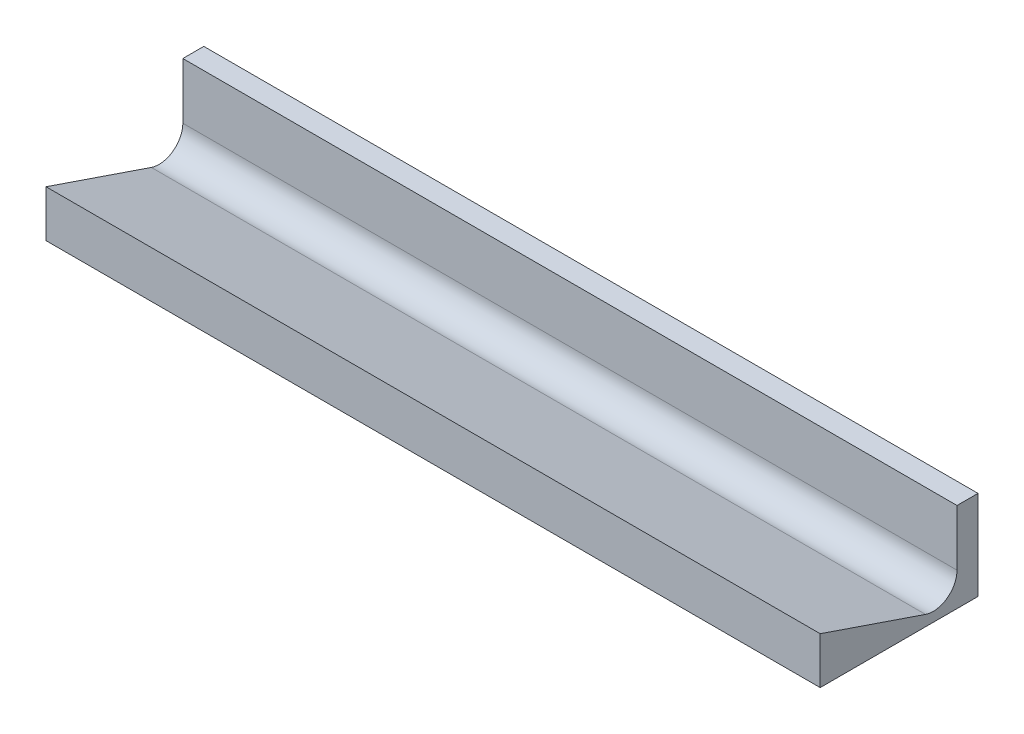
ISO-10303-21;
HEADER;
FILE_DESCRIPTION(('STEP AP214'),'2;1');
FILE_NAME('part.step','',(''),(''),'','','');
FILE_SCHEMA(('AUTOMOTIVE_DESIGN { 1 0 10303 214 1 1 1 1 }'));
ENDSEC;
DATA;
#1=APPLICATION_CONTEXT('core data for automotive mechanical design processes');
#2=APPLICATION_PROTOCOL_DEFINITION('international standard','automotive_design',2000,#1);
#3=PRODUCT_CONTEXT('',#1,'mechanical');
#4=PRODUCT('Part','Part','',(#3));
#5=PRODUCT_RELATED_PRODUCT_CATEGORY('part','',(#4));
#6=PRODUCT_DEFINITION_FORMATION('','',#4);
#7=PRODUCT_DEFINITION_CONTEXT('part definition',#1,'design');
#8=PRODUCT_DEFINITION('design','',#6,#7);
#9=PRODUCT_DEFINITION_SHAPE('','',#8);
#10=(LENGTH_UNIT() NAMED_UNIT(*) SI_UNIT(.MILLI.,.METRE.));
#11=(NAMED_UNIT(*) PLANE_ANGLE_UNIT() SI_UNIT($,.RADIAN.));
#12=(NAMED_UNIT(*) SI_UNIT($,.STERADIAN.) SOLID_ANGLE_UNIT());
#13=UNCERTAINTY_MEASURE_WITH_UNIT(LENGTH_MEASURE(1.E-05),#10,'distance_accuracy_value','');
#14=(GEOMETRIC_REPRESENTATION_CONTEXT(3) GLOBAL_UNCERTAINTY_ASSIGNED_CONTEXT((#13)) GLOBAL_UNIT_ASSIGNED_CONTEXT((#10,
#11,#12)) REPRESENTATION_CONTEXT('',''));
#15=CARTESIAN_POINT('',(0.,0.,0.));
#16=DIRECTION('',(0.,0.,1.));
#17=DIRECTION('',(1.,0.,0.));
#18=AXIS2_PLACEMENT_3D('',#15,#16,#17);
#19=CARTESIAN_POINT('',(-45.,-8.,-8.25));
#20=DIRECTION('',(0.,0.,1.));
#21=DIRECTION('',(1.,0.,0.));
#22=AXIS2_PLACEMENT_3D('',#19,#20,#21);
#23=PLANE('',#22);
#24=DIRECTION('',(1.,0.,0.));
#25=VECTOR('',#24,1.);
#26=CARTESIAN_POINT('',(-45.,-8.,-8.25));
#27=LINE('',#26,#25);
#28=CARTESIAN_POINT('',(-42.,-8.,-8.25));
#29=VERTEX_POINT('',#28);
#30=CARTESIAN_POINT('',(-40.,-8.,-8.25));
#31=VERTEX_POINT('',#30);
#32=EDGE_CURVE('E260',#29,#31,#27,.T.);
#33=ORIENTED_EDGE('',*,*,#32,.F.);
#34=DIRECTION('',(0.,1.,0.));
#35=VECTOR('',#34,1.);
#36=CARTESIAN_POINT('',(-42.,0.,-8.25));
#37=LINE('',#36,#35);
#38=CARTESIAN_POINT('',(-42.,0.,-8.25));
#39=VERTEX_POINT('',#38);
#40=EDGE_CURVE('E243',#29,#39,#37,.T.);
#41=ORIENTED_EDGE('',*,*,#40,.T.);
#42=DIRECTION('',(1.,0.,0.));
#43=VECTOR('',#42,1.);
#44=CARTESIAN_POINT('',(-45.,0.,-8.25));
#45=LINE('',#44,#43);
#46=CARTESIAN_POINT('',(-40.,0.,-8.25));
#47=VERTEX_POINT('',#46);
#48=EDGE_CURVE('E257',#39,#47,#45,.T.);
#49=ORIENTED_EDGE('',*,*,#48,.T.);
#50=DIRECTION('',(0.,1.,0.));
#51=VECTOR('',#50,1.);
#52=CARTESIAN_POINT('',(-40.,-8.,-8.25));
#53=LINE('',#52,#51);
#54=CARTESIAN_POINT('',(-40.,-5.,-8.25));
#55=VERTEX_POINT('',#54);
#56=EDGE_CURVE('E287',#55,#47,#53,.T.);
#57=ORIENTED_EDGE('',*,*,#56,.F.);
#58=DIRECTION('',(-1.,0.,0.));
#59=VECTOR('',#58,1.);
#60=CARTESIAN_POINT('',(0.,-4.99999999999996,-8.25));
#61=LINE('',#60,#59);
#62=CARTESIAN_POINT('',(-39.,-5.,-8.25));
#63=VERTEX_POINT('',#62);
#64=EDGE_CURVE('E477',#63,#55,#61,.T.);
#65=ORIENTED_EDGE('',*,*,#64,.F.);
#66=DIRECTION('',(0.316227766016838,0.948683298050514,0.));
#67=VECTOR('',#66,1.);
#68=CARTESIAN_POINT('',(-33.6,11.2,-8.25));
#69=LINE('',#68,#67);
#70=EDGE_CURVE('E472',#31,#63,#69,.T.);
#71=ORIENTED_EDGE('',*,*,#70,.F.);
#72=EDGE_LOOP('',(#33,#41,#49,#57,#65,#71));
#73=FACE_BOUND('',#72,.T.);
#74=ADVANCED_FACE('F39',(#73),#23,.F.);
#75=CARTESIAN_POINT('',(-45.,-8.,-1.25));
#76=DIRECTION('',(0.,0.,-1.));
#77=DIRECTION('',(-1.,0.,0.));
#78=AXIS2_PLACEMENT_3D('',#75,#76,#77);
#79=PLANE('',#78);
#80=DIRECTION('',(-1.,0.,0.));
#81=VECTOR('',#80,1.);
#82=CARTESIAN_POINT('',(-45.,0.,-1.25));
#83=LINE('',#82,#81);
#84=CARTESIAN_POINT('',(-40.,0.,-1.25));
#85=VERTEX_POINT('',#84);
#86=CARTESIAN_POINT('',(-42.,0.,-1.25));
#87=VERTEX_POINT('',#86);
#88=EDGE_CURVE('E278',#85,#87,#83,.T.);
#89=ORIENTED_EDGE('',*,*,#88,.T.);
#90=DIRECTION('',(0.,1.,0.));
#91=VECTOR('',#90,1.);
#92=CARTESIAN_POINT('',(-42.,0.,-1.25));
#93=LINE('',#92,#91);
#94=CARTESIAN_POINT('',(-42.,-8.,-1.25));
#95=VERTEX_POINT('',#94);
#96=EDGE_CURVE('E246',#95,#87,#93,.T.);
#97=ORIENTED_EDGE('',*,*,#96,.F.);
#98=DIRECTION('',(-1.,0.,0.));
#99=VECTOR('',#98,1.);
#100=CARTESIAN_POINT('',(-45.,-8.,-1.25));
#101=LINE('',#100,#99);
#102=CARTESIAN_POINT('',(-40.,-8.,-1.25));
#103=VERTEX_POINT('',#102);
#104=EDGE_CURVE('E285',#103,#95,#101,.T.);
#105=ORIENTED_EDGE('',*,*,#104,.F.);
#106=DIRECTION('',(0.316227766016838,0.948683298050514,0.));
#107=VECTOR('',#106,1.);
#108=CARTESIAN_POINT('',(-33.6,11.2,-1.25));
#109=LINE('',#108,#107);
#110=CARTESIAN_POINT('',(-39.,-5.,-1.25));
#111=VERTEX_POINT('',#110);
#112=EDGE_CURVE('E473',#103,#111,#109,.T.);
#113=ORIENTED_EDGE('',*,*,#112,.T.);
#114=DIRECTION('',(-1.,0.,0.));
#115=VECTOR('',#114,1.);
#116=CARTESIAN_POINT('',(0.,-4.99999999999996,-1.25));
#117=LINE('',#116,#115);
#118=CARTESIAN_POINT('',(-40.,-5.,-1.25));
#119=VERTEX_POINT('',#118);
#120=EDGE_CURVE('E476',#111,#119,#117,.T.);
#121=ORIENTED_EDGE('',*,*,#120,.T.);
#122=DIRECTION('',(0.,1.,0.));
#123=VECTOR('',#122,1.);
#124=CARTESIAN_POINT('',(-40.,-8.,-1.25));
#125=LINE('',#124,#123);
#126=EDGE_CURVE('E284',#119,#85,#125,.T.);
#127=ORIENTED_EDGE('',*,*,#126,.T.);
#128=EDGE_LOOP('',(#89,#97,#105,#113,#121,#127));
#129=FACE_BOUND('',#128,.T.);
#130=ADVANCED_FACE('F382',(#129),#79,.F.);
#131=CARTESIAN_POINT('',(0.,-8.,0.));
#132=DIRECTION('',(0.,-1.,0.));
#133=DIRECTION('',(0.,0.,-1.));
#134=AXIS2_PLACEMENT_3D('',#131,#132,#133);
#135=PLANE('',#134);
#136=DIRECTION('',(0.,0.,1.));
#137=VECTOR('',#136,1.);
#138=CARTESIAN_POINT('',(-42.,-8.,-8.25));
#139=LINE('',#138,#137);
#140=EDGE_CURVE('E422',#29,#95,#139,.T.);
#141=ORIENTED_EDGE('',*,*,#140,.F.);
#142=ORIENTED_EDGE('',*,*,#32,.T.);
#143=DIRECTION('',(0.,0.,1.));
#144=VECTOR('',#143,1.);
#145=CARTESIAN_POINT('',(-40.,-8.,-1.25));
#146=LINE('',#145,#144);
#147=EDGE_CURVE('E543',#31,#103,#146,.T.);
#148=ORIENTED_EDGE('',*,*,#147,.T.);
#149=ORIENTED_EDGE('',*,*,#104,.T.);
#150=EDGE_LOOP('',(#141,#142,#148,#149));
#151=FACE_BOUND('',#150,.T.);
#152=ADVANCED_FACE('F388',(#151),#135,.T.);
#153=CARTESIAN_POINT('',(45.,-8.,-1.25));
#154=DIRECTION('',(0.,0.,-1.));
#155=DIRECTION('',(-1.,0.,0.));
#156=AXIS2_PLACEMENT_3D('',#153,#154,#155);
#157=PLANE('',#156);
#158=DIRECTION('',(0.,-1.,0.));
#159=VECTOR('',#158,1.);
#160=CARTESIAN_POINT('',(43.,0.,-1.25));
#161=LINE('',#160,#159);
#162=CARTESIAN_POINT('',(43.,0.,-1.25));
#163=VERTEX_POINT('',#162);
#164=CARTESIAN_POINT('',(43.,-8.,-1.25));
#165=VERTEX_POINT('',#164);
#166=EDGE_CURVE('E431',#163,#165,#161,.T.);
#167=ORIENTED_EDGE('',*,*,#166,.T.);
#168=DIRECTION('',(-1.,0.,0.));
#169=VECTOR('',#168,1.);
#170=CARTESIAN_POINT('',(45.,-8.,-1.25));
#171=LINE('',#170,#169);
#172=CARTESIAN_POINT('',(45.,-8.,-1.25));
#173=VERTEX_POINT('',#172);
#174=EDGE_CURVE('E508',#173,#165,#171,.T.);
#175=ORIENTED_EDGE('',*,*,#174,.F.);
#176=DIRECTION('',(-0.316227766016838,-0.948683298050514,0.));
#177=VECTOR('',#176,1.);
#178=CARTESIAN_POINT('',(42.9,-14.3,-1.25));
#179=LINE('',#178,#177);
#180=CARTESIAN_POINT('',(46.,-5.,-1.25));
#181=VERTEX_POINT('',#180);
#182=EDGE_CURVE('E457',#181,#173,#179,.T.);
#183=ORIENTED_EDGE('',*,*,#182,.F.);
#184=DIRECTION('',(1.,0.,0.));
#185=VECTOR('',#184,1.);
#186=CARTESIAN_POINT('',(0.,-5.,-1.25));
#187=LINE('',#186,#185);
#188=CARTESIAN_POINT('',(45.,-5.,-1.25));
#189=VERTEX_POINT('',#188);
#190=EDGE_CURVE('E459',#189,#181,#187,.T.);
#191=ORIENTED_EDGE('',*,*,#190,.F.);
#192=DIRECTION('',(0.,1.,0.));
#193=VECTOR('',#192,1.);
#194=CARTESIAN_POINT('',(45.,-8.,-1.25));
#195=LINE('',#194,#193);
#196=CARTESIAN_POINT('',(45.,0.,-1.25));
#197=VERTEX_POINT('',#196);
#198=EDGE_CURVE('E272',#189,#197,#195,.T.);
#199=ORIENTED_EDGE('',*,*,#198,.T.);
#200=DIRECTION('',(-1.,0.,0.));
#201=VECTOR('',#200,1.);
#202=CARTESIAN_POINT('',(45.,0.,-1.25));
#203=LINE('',#202,#201);
#204=EDGE_CURVE('E522',#197,#163,#203,.T.);
#205=ORIENTED_EDGE('',*,*,#204,.T.);
#206=EDGE_LOOP('',(#167,#175,#183,#191,#199,#205));
#207=FACE_BOUND('',#206,.T.);
#208=ADVANCED_FACE('F592',(#207),#157,.F.);
#209=DIRECTION('',(0.,1.,0.));
#210=VECTOR('',#209,1.);
#211=CARTESIAN_POINT('',(42.,0.,-1.25));
#212=LINE('',#211,#210);
#213=CARTESIAN_POINT('',(42.,-8.,-1.25));
#214=VERTEX_POINT('',#213);
#215=CARTESIAN_POINT('',(42.,0.,-1.25));
#216=VERTEX_POINT('',#215);
#217=EDGE_CURVE('E62',#214,#216,#212,.T.);
#218=ORIENTED_EDGE('',*,*,#217,.T.);
#219=CARTESIAN_POINT('',(40.,0.,-1.25));
#220=VERTEX_POINT('',#219);
#221=EDGE_CURVE('E521',#216,#220,#203,.T.);
#222=ORIENTED_EDGE('',*,*,#221,.T.);
#223=DIRECTION('',(0.,1.,0.));
#224=VECTOR('',#223,1.);
#225=CARTESIAN_POINT('',(40.,-8.,-1.25));
#226=LINE('',#225,#224);
#227=CARTESIAN_POINT('',(40.,-5.,-1.25));
#228=VERTEX_POINT('',#227);
#229=EDGE_CURVE('E535',#228,#220,#226,.T.);
#230=ORIENTED_EDGE('',*,*,#229,.F.);
#231=DIRECTION('',(-1.,0.,0.));
#232=VECTOR('',#231,1.);
#233=CARTESIAN_POINT('',(0.,-5.,-1.25));
#234=LINE('',#233,#232);
#235=CARTESIAN_POINT('',(39.,-5.,-1.25));
#236=VERTEX_POINT('',#235);
#237=EDGE_CURVE('E441',#228,#236,#234,.T.);
#238=ORIENTED_EDGE('',*,*,#237,.T.);
#239=DIRECTION('',(0.316227766016838,-0.948683298050514,0.));
#240=VECTOR('',#239,1.);
#241=CARTESIAN_POINT('',(33.6,11.2,-1.25));
#242=LINE('',#241,#240);
#243=CARTESIAN_POINT('',(40.,-8.,-1.25));
#244=VERTEX_POINT('',#243);
#245=EDGE_CURVE('E444',#236,#244,#242,.T.);
#246=ORIENTED_EDGE('',*,*,#245,.T.);
#247=EDGE_CURVE('E506',#214,#244,#171,.T.);
#248=ORIENTED_EDGE('',*,*,#247,.F.);
#249=EDGE_LOOP('',(#218,#222,#230,#238,#246,#248));
#250=FACE_BOUND('',#249,.T.);
#251=ADVANCED_FACE('F585',(#250),#157,.F.);
#252=CARTESIAN_POINT('',(45.,-8.,-8.25));
#253=DIRECTION('',(0.,0.,1.));
#254=DIRECTION('',(1.,0.,0.));
#255=AXIS2_PLACEMENT_3D('',#252,#253,#254);
#256=PLANE('',#255);
#257=DIRECTION('',(0.,-1.,0.));
#258=VECTOR('',#257,1.);
#259=CARTESIAN_POINT('',(43.,0.,-8.25));
#260=LINE('',#259,#258);
#261=CARTESIAN_POINT('',(43.,0.,-8.25));
#262=VERTEX_POINT('',#261);
#263=CARTESIAN_POINT('',(43.,-8.,-8.25));
#264=VERTEX_POINT('',#263);
#265=EDGE_CURVE('E426',#262,#264,#260,.T.);
#266=ORIENTED_EDGE('',*,*,#265,.F.);
#267=DIRECTION('',(1.,0.,0.));
#268=VECTOR('',#267,1.);
#269=CARTESIAN_POINT('',(45.,0.,-8.25));
#270=LINE('',#269,#268);
#271=CARTESIAN_POINT('',(45.,0.,-8.25));
#272=VERTEX_POINT('',#271);
#273=EDGE_CURVE('E528',#262,#272,#270,.T.);
#274=ORIENTED_EDGE('',*,*,#273,.T.);
#275=DIRECTION('',(0.,1.,0.));
#276=VECTOR('',#275,1.);
#277=CARTESIAN_POINT('',(45.,-8.,-8.25));
#278=LINE('',#277,#276);
#279=CARTESIAN_POINT('',(45.,-5.,-8.25));
#280=VERTEX_POINT('',#279);
#281=EDGE_CURVE('E518',#280,#272,#278,.T.);
#282=ORIENTED_EDGE('',*,*,#281,.F.);
#283=DIRECTION('',(1.,0.,0.));
#284=VECTOR('',#283,1.);
#285=CARTESIAN_POINT('',(0.,-5.,-8.25));
#286=LINE('',#285,#284);
#287=CARTESIAN_POINT('',(46.,-5.,-8.25));
#288=VERTEX_POINT('',#287);
#289=EDGE_CURVE('E460',#280,#288,#286,.T.);
#290=ORIENTED_EDGE('',*,*,#289,.T.);
#291=DIRECTION('',(-0.316227766016838,-0.948683298050514,0.));
#292=VECTOR('',#291,1.);
#293=CARTESIAN_POINT('',(42.9,-14.3,-8.25));
#294=LINE('',#293,#292);
#295=CARTESIAN_POINT('',(45.,-8.,-8.25));
#296=VERTEX_POINT('',#295);
#297=EDGE_CURVE('E456',#288,#296,#294,.T.);
#298=ORIENTED_EDGE('',*,*,#297,.T.);
#299=DIRECTION('',(1.,0.,0.));
#300=VECTOR('',#299,1.);
#301=CARTESIAN_POINT('',(45.,-8.,-8.25));
#302=LINE('',#301,#300);
#303=EDGE_CURVE('E514',#264,#296,#302,.T.);
#304=ORIENTED_EDGE('',*,*,#303,.F.);
#305=EDGE_LOOP('',(#266,#274,#282,#290,#298,#304));
#306=FACE_BOUND('',#305,.T.);
#307=ADVANCED_FACE('F582',(#306),#256,.F.);
#308=DIRECTION('',(0.,1.,0.));
#309=VECTOR('',#308,1.);
#310=CARTESIAN_POINT('',(42.,0.,-8.25));
#311=LINE('',#310,#309);
#312=CARTESIAN_POINT('',(42.,-8.,-8.25));
#313=VERTEX_POINT('',#312);
#314=CARTESIAN_POINT('',(42.,0.,-8.25));
#315=VERTEX_POINT('',#314);
#316=EDGE_CURVE('E428',#313,#315,#311,.T.);
#317=ORIENTED_EDGE('',*,*,#316,.F.);
#318=CARTESIAN_POINT('',(40.,-8.,-8.25));
#319=VERTEX_POINT('',#318);
#320=EDGE_CURVE('E515',#319,#313,#302,.T.);
#321=ORIENTED_EDGE('',*,*,#320,.F.);
#322=DIRECTION('',(0.316227766016838,-0.948683298050514,0.));
#323=VECTOR('',#322,1.);
#324=CARTESIAN_POINT('',(33.6,11.2,-8.25));
#325=LINE('',#324,#323);
#326=CARTESIAN_POINT('',(39.,-5.,-8.25));
#327=VERTEX_POINT('',#326);
#328=EDGE_CURVE('E445',#327,#319,#325,.T.);
#329=ORIENTED_EDGE('',*,*,#328,.F.);
#330=DIRECTION('',(-1.,0.,0.));
#331=VECTOR('',#330,1.);
#332=CARTESIAN_POINT('',(0.,-5.,-8.25));
#333=LINE('',#332,#331);
#334=CARTESIAN_POINT('',(40.,-5.,-8.25));
#335=VERTEX_POINT('',#334);
#336=EDGE_CURVE('E424',#335,#327,#333,.T.);
#337=ORIENTED_EDGE('',*,*,#336,.F.);
#338=DIRECTION('',(0.,1.,0.));
#339=VECTOR('',#338,1.);
#340=CARTESIAN_POINT('',(40.,-8.,-8.25));
#341=LINE('',#340,#339);
#342=CARTESIAN_POINT('',(40.,0.,-8.25));
#343=VERTEX_POINT('',#342);
#344=EDGE_CURVE('E533',#335,#343,#341,.T.);
#345=ORIENTED_EDGE('',*,*,#344,.T.);
#346=EDGE_CURVE('E507',#343,#315,#270,.T.);
#347=ORIENTED_EDGE('',*,*,#346,.T.);
#348=EDGE_LOOP('',(#317,#321,#329,#337,#345,#347));
#349=FACE_BOUND('',#348,.T.);
#350=ADVANCED_FACE('F580',(#349),#256,.F.);
#351=CARTESIAN_POINT('',(0.,-8.,0.));
#352=DIRECTION('',(0.,1.,0.));
#353=DIRECTION('',(0.,0.,1.));
#354=AXIS2_PLACEMENT_3D('',#351,#352,#353);
#355=PLANE('',#354);
#356=DIRECTION('',(0.,0.,1.));
#357=VECTOR('',#356,1.);
#358=CARTESIAN_POINT('',(43.,-8.,-8.25));
#359=LINE('',#358,#357);
#360=EDGE_CURVE('E420',#264,#165,#359,.T.);
#361=ORIENTED_EDGE('',*,*,#360,.F.);
#362=ORIENTED_EDGE('',*,*,#303,.T.);
#363=DIRECTION('',(0.,0.,1.));
#364=VECTOR('',#363,1.);
#365=CARTESIAN_POINT('',(45.,-8.,-1.25));
#366=LINE('',#365,#364);
#367=EDGE_CURVE('E503',#296,#173,#366,.T.);
#368=ORIENTED_EDGE('',*,*,#367,.T.);
#369=ORIENTED_EDGE('',*,*,#174,.T.);
#370=EDGE_LOOP('',(#361,#362,#368,#369));
#371=FACE_BOUND('',#370,.T.);
#372=ADVANCED_FACE('F576',(#371),#355,.F.);
#373=DIRECTION('',(0.,0.,1.));
#374=VECTOR('',#373,1.);
#375=CARTESIAN_POINT('',(42.,-8.,-8.25));
#376=LINE('',#375,#374);
#377=EDGE_CURVE('E436',#313,#214,#376,.T.);
#378=ORIENTED_EDGE('',*,*,#377,.T.);
#379=ORIENTED_EDGE('',*,*,#247,.T.);
#380=DIRECTION('',(0.,0.,-1.));
#381=VECTOR('',#380,1.);
#382=CARTESIAN_POINT('',(40.,-8.,-1.25));
#383=LINE('',#382,#381);
#384=EDGE_CURVE('E511',#244,#319,#383,.T.);
#385=ORIENTED_EDGE('',*,*,#384,.T.);
#386=ORIENTED_EDGE('',*,*,#320,.T.);
#387=EDGE_LOOP('',(#378,#379,#385,#386));
#388=FACE_BOUND('',#387,.T.);
#389=ADVANCED_FACE('F579',(#388),#355,.F.);
#390=CARTESIAN_POINT('',(40.,-8.,-1.25));
#391=DIRECTION('',(1.,0.,0.));
#392=DIRECTION('',(0.,0.,-1.));
#393=AXIS2_PLACEMENT_3D('',#390,#391,#392);
#394=PLANE('',#393);
#395=DIRECTION('',(0.,0.,-1.));
#396=VECTOR('',#395,1.);
#397=CARTESIAN_POINT('',(40.,-5.,-1.25));
#398=LINE('',#397,#396);
#399=EDGE_CURVE('E448',#228,#335,#398,.T.);
#400=ORIENTED_EDGE('',*,*,#399,.F.);
#401=ORIENTED_EDGE('',*,*,#229,.T.);
#402=DIRECTION('',(0.,0.,-1.));
#403=VECTOR('',#402,1.);
#404=CARTESIAN_POINT('',(40.,0.,-1.25));
#405=LINE('',#404,#403);
#406=EDGE_CURVE('E525',#220,#343,#405,.T.);
#407=ORIENTED_EDGE('',*,*,#406,.T.);
#408=ORIENTED_EDGE('',*,*,#344,.F.);
#409=EDGE_LOOP('',(#400,#401,#407,#408));
#410=FACE_BOUND('',#409,.T.);
#411=ADVANCED_FACE('F587',(#410),#394,.F.);
#412=CARTESIAN_POINT('',(-40.,-8.,-1.25));
#413=DIRECTION('',(-1.,0.,0.));
#414=DIRECTION('',(0.,0.,1.));
#415=AXIS2_PLACEMENT_3D('',#412,#413,#414);
#416=PLANE('',#415);
#417=DIRECTION('',(0.,0.,-1.));
#418=VECTOR('',#417,1.);
#419=CARTESIAN_POINT('',(-40.,-5.,-1.25));
#420=LINE('',#419,#418);
#421=EDGE_CURVE('E479',#119,#55,#420,.T.);
#422=ORIENTED_EDGE('',*,*,#421,.T.);
#423=ORIENTED_EDGE('',*,*,#56,.T.);
#424=DIRECTION('',(0.,0.,1.));
#425=VECTOR('',#424,1.);
#426=CARTESIAN_POINT('',(-40.,0.,-1.25));
#427=LINE('',#426,#425);
#428=EDGE_CURVE('E266',#47,#85,#427,.T.);
#429=ORIENTED_EDGE('',*,*,#428,.T.);
#430=ORIENTED_EDGE('',*,*,#126,.F.);
#431=EDGE_LOOP('',(#422,#423,#429,#430));
#432=FACE_BOUND('',#431,.T.);
#433=ADVANCED_FACE('F590',(#432),#416,.F.);
#434=CARTESIAN_POINT('',(-45.,-8.,-1.25));
#435=DIRECTION('',(1.,0.,0.));
#436=DIRECTION('',(0.,0.,-1.));
#437=AXIS2_PLACEMENT_3D('',#434,#435,#436);
#438=PLANE('',#437);
#439=DIRECTION('',(0.,0.,-1.));
#440=VECTOR('',#439,1.);
#441=CARTESIAN_POINT('',(-45.,-5.,-1.25));
#442=LINE('',#441,#440);
#443=CARTESIAN_POINT('',(-45.,-5.,-1.25));
#444=VERTEX_POINT('',#443);
#445=CARTESIAN_POINT('',(-45.,-5.,-8.25));
#446=VERTEX_POINT('',#445);
#447=EDGE_CURVE('E500',#444,#446,#442,.T.);
#448=ORIENTED_EDGE('',*,*,#447,.F.);
#449=DIRECTION('',(0.,1.,0.));
#450=VECTOR('',#449,1.);
#451=CARTESIAN_POINT('',(-45.,-8.,-1.25));
#452=LINE('',#451,#450);
#453=CARTESIAN_POINT('',(-45.,0.,-1.25));
#454=VERTEX_POINT('',#453);
#455=EDGE_CURVE('E281',#444,#454,#452,.T.);
#456=ORIENTED_EDGE('',*,*,#455,.T.);
#457=DIRECTION('',(0.,0.,-1.));
#458=VECTOR('',#457,1.);
#459=CARTESIAN_POINT('',(-45.,0.,-1.25));
#460=LINE('',#459,#458);
#461=CARTESIAN_POINT('',(-45.,0.,-8.25));
#462=VERTEX_POINT('',#461);
#463=EDGE_CURVE('E268',#454,#462,#460,.T.);
#464=ORIENTED_EDGE('',*,*,#463,.T.);
#465=DIRECTION('',(0.,1.,0.));
#466=VECTOR('',#465,1.);
#467=CARTESIAN_POINT('',(-45.,-8.,-8.25));
#468=LINE('',#467,#466);
#469=EDGE_CURVE('E289',#446,#462,#468,.T.);
#470=ORIENTED_EDGE('',*,*,#469,.F.);
#471=EDGE_LOOP('',(#448,#456,#464,#470));
#472=FACE_BOUND('',#471,.T.);
#473=ADVANCED_FACE('F561',(#472),#438,.F.);
#474=CARTESIAN_POINT('',(0.,0.,0.));
#475=DIRECTION('',(0.,-1.,0.));
#476=DIRECTION('',(0.,0.,-1.));
#477=AXIS2_PLACEMENT_3D('',#474,#475,#476);
#478=PLANE('',#477);
#479=DIRECTION('',(0.,0.,1.));
#480=VECTOR('',#479,1.);
#481=CARTESIAN_POINT('',(-43.,0.,-8.25));
#482=LINE('',#481,#480);
#483=CARTESIAN_POINT('',(-43.,0.,-8.25));
#484=VERTEX_POINT('',#483);
#485=CARTESIAN_POINT('',(-43.,0.,-1.25));
#486=VERTEX_POINT('',#485);
#487=EDGE_CURVE('E251',#484,#486,#482,.T.);
#488=ORIENTED_EDGE('',*,*,#487,.F.);
#489=EDGE_CURVE('E267',#462,#484,#45,.T.);
#490=ORIENTED_EDGE('',*,*,#489,.F.);
#491=ORIENTED_EDGE('',*,*,#463,.F.);
#492=EDGE_CURVE('E277',#486,#454,#83,.T.);
#493=ORIENTED_EDGE('',*,*,#492,.F.);
#494=EDGE_LOOP('',(#488,#490,#491,#493));
#495=FACE_BOUND('',#494,.T.);
#496=ORIENTED_EDGE('',*,*,#221,.F.);
#497=DIRECTION('',(0.,0.,1.));
#498=VECTOR('',#497,1.);
#499=CARTESIAN_POINT('',(42.,0.,-8.25));
#500=LINE('',#499,#498);
#501=EDGE_CURVE('E438',#315,#216,#500,.T.);
#502=ORIENTED_EDGE('',*,*,#501,.F.);
#503=ORIENTED_EDGE('',*,*,#346,.F.);
#504=ORIENTED_EDGE('',*,*,#406,.F.);
#505=EDGE_LOOP('',(#496,#502,#503,#504));
#506=FACE_BOUND('',#505,.T.);
#507=DIRECTION('',(0.,0.,-1.));
#508=VECTOR('',#507,1.);
#509=CARTESIAN_POINT('',(65.,0.,13.25));
#510=LINE('',#509,#508);
#511=CARTESIAN_POINT('',(65.,0.,13.25));
#512=VERTEX_POINT('',#511);
#513=CARTESIAN_POINT('',(65.,0.,-13.25));
#514=VERTEX_POINT('',#513);
#515=EDGE_CURVE('E312',#512,#514,#510,.T.);
#516=ORIENTED_EDGE('',*,*,#515,.F.);
#517=DIRECTION('',(1.,0.,0.));
#518=VECTOR('',#517,1.);
#519=CARTESIAN_POINT('',(-65.,0.,13.25));
#520=LINE('',#519,#518);
#521=CARTESIAN_POINT('',(-65.,0.,13.25));
#522=VERTEX_POINT('',#521);
#523=EDGE_CURVE('E316',#522,#512,#520,.T.);
#524=ORIENTED_EDGE('',*,*,#523,.F.);
#525=DIRECTION('',(0.,0.,1.));
#526=VECTOR('',#525,1.);
#527=CARTESIAN_POINT('',(-65.,0.,13.25));
#528=LINE('',#527,#526);
#529=CARTESIAN_POINT('',(-65.,0.,-13.25));
#530=VERTEX_POINT('',#529);
#531=EDGE_CURVE('E326',#530,#522,#528,.T.);
#532=ORIENTED_EDGE('',*,*,#531,.F.);
#533=DIRECTION('',(-1.,0.,0.));
#534=VECTOR('',#533,1.);
#535=CARTESIAN_POINT('',(-65.,0.,-13.25));
#536=LINE('',#535,#534);
#537=EDGE_CURVE('E324',#514,#530,#536,.T.);
#538=ORIENTED_EDGE('',*,*,#537,.F.);
#539=EDGE_LOOP('',(#516,#524,#532,#538));
#540=FACE_BOUND('',#539,.T.);
#541=ORIENTED_EDGE('',*,*,#48,.F.);
#542=DIRECTION('',(0.,0.,1.));
#543=VECTOR('',#542,1.);
#544=CARTESIAN_POINT('',(-42.,0.,-8.25));
#545=LINE('',#544,#543);
#546=EDGE_CURVE('E240',#39,#87,#545,.T.);
#547=ORIENTED_EDGE('',*,*,#546,.T.);
#548=ORIENTED_EDGE('',*,*,#88,.F.);
#549=ORIENTED_EDGE('',*,*,#428,.F.);
#550=EDGE_LOOP('',(#541,#547,#548,#549));
#551=FACE_BOUND('',#550,.T.);
#552=ORIENTED_EDGE('',*,*,#204,.F.);
#553=DIRECTION('',(0.,0.,1.));
#554=VECTOR('',#553,1.);
#555=CARTESIAN_POINT('',(45.,0.,-1.25));
#556=LINE('',#555,#554);
#557=EDGE_CURVE('E502',#272,#197,#556,.T.);
#558=ORIENTED_EDGE('',*,*,#557,.F.);
#559=ORIENTED_EDGE('',*,*,#273,.F.);
#560=DIRECTION('',(0.,0.,1.));
#561=VECTOR('',#560,1.);
#562=CARTESIAN_POINT('',(43.,0.,-8.25));
#563=LINE('',#562,#561);
#564=EDGE_CURVE('E430',#262,#163,#563,.T.);
#565=ORIENTED_EDGE('',*,*,#564,.T.);
#566=EDGE_LOOP('',(#552,#558,#559,#565));
#567=FACE_BOUND('',#566,.T.);
#568=ADVANCED_FACE('F263',(#495,#506,#540,#551,#567),#478,.T.);
#569=CARTESIAN_POINT('',(65.,15.,13.25));
#570=DIRECTION('',(-1.,0.,0.));
#571=DIRECTION('',(0.,0.,1.));
#572=AXIS2_PLACEMENT_3D('',#569,#570,#571);
#573=PLANE('',#572);
#574=DIRECTION('',(0.,1.,0.));
#575=VECTOR('',#574,1.);
#576=CARTESIAN_POINT('',(65.,0.,-9.72599512124913));
#577=LINE('',#576,#575);
#578=CARTESIAN_POINT('',(65.,5.59111916202415,-9.72599512124913));
#579=VERTEX_POINT('',#578);
#580=CARTESIAN_POINT('',(65.,15.,-9.72599512124913));
#581=VERTEX_POINT('',#580);
#582=EDGE_CURVE('E295',#579,#581,#577,.T.);
#583=ORIENTED_EDGE('',*,*,#582,.F.);
#584=CARTESIAN_POINT('',(65.,5.59111916202415,-5.72599512124913));
#585=DIRECTION('',(-1.,0.,0.));
#586=DIRECTION('',(0.,0.,1.));
#587=AXIS2_PLACEMENT_3D('',#584,#585,#586);
#588=CIRCLE('',#587,4.);
#589=CARTESIAN_POINT('',(65.,1.80539147049683,-4.43438146167316));
#590=VERTEX_POINT('',#589);
#591=EDGE_CURVE('E291',#590,#579,#588,.F.);
#592=ORIENTED_EDGE('',*,*,#591,.F.);
#593=DIRECTION('',(0.,-0.322903414893991,-0.946431922881831));
#594=VECTOR('',#593,1.);
#595=CARTESIAN_POINT('',(65.,2.97232343629376,-1.01409659220517));
#596=LINE('',#595,#594);
#597=CARTESIAN_POINT('',(65.,7.83894446697079,13.2500000000001));
#598=VERTEX_POINT('',#597);
#599=EDGE_CURVE('E293',#598,#590,#596,.T.);
#600=ORIENTED_EDGE('',*,*,#599,.F.);
#601=DIRECTION('',(0.,-1.,0.));
#602=VECTOR('',#601,1.);
#603=CARTESIAN_POINT('',(65.,15.,13.25));
#604=LINE('',#603,#602);
#605=EDGE_CURVE('E321',#598,#512,#604,.T.);
#606=ORIENTED_EDGE('',*,*,#605,.T.);
#607=ORIENTED_EDGE('',*,*,#515,.T.);
#608=DIRECTION('',(0.,-1.,0.));
#609=VECTOR('',#608,1.);
#610=CARTESIAN_POINT('',(65.,15.,-13.25));
#611=LINE('',#610,#609);
#612=CARTESIAN_POINT('',(65.,15.,-13.25));
#613=VERTEX_POINT('',#612);
#614=EDGE_CURVE('E47',#613,#514,#611,.T.);
#615=ORIENTED_EDGE('',*,*,#614,.F.);
#616=DIRECTION('',(0.,0.,-1.));
#617=VECTOR('',#616,1.);
#618=CARTESIAN_POINT('',(65.,15.,13.25));
#619=LINE('',#618,#617);
#620=EDGE_CURVE('E313',#581,#613,#619,.T.);
#621=ORIENTED_EDGE('',*,*,#620,.F.);
#622=EDGE_LOOP('',(#583,#592,#600,#606,#607,#615,#621));
#623=FACE_BOUND('',#622,.T.);
#624=ADVANCED_FACE('F41',(#623),#573,.F.);
#625=CARTESIAN_POINT('',(-65.,15.,13.25));
#626=DIRECTION('',(1.,0.,0.));
#627=DIRECTION('',(0.,0.,-1.));
#628=AXIS2_PLACEMENT_3D('',#625,#626,#627);
#629=PLANE('',#628);
#630=DIRECTION('',(0.,-1.,0.));
#631=VECTOR('',#630,1.);
#632=CARTESIAN_POINT('',(-65.,15.,-9.72599512124922));
#633=LINE('',#632,#631);
#634=CARTESIAN_POINT('',(-65.,15.,-9.72599512124922));
#635=VERTEX_POINT('',#634);
#636=CARTESIAN_POINT('',(-65.,5.59111916202415,-9.72599512124922));
#637=VERTEX_POINT('',#636);
#638=EDGE_CURVE('E308',#635,#637,#633,.T.);
#639=ORIENTED_EDGE('',*,*,#638,.F.);
#640=DIRECTION('',(0.,0.,1.));
#641=VECTOR('',#640,1.);
#642=CARTESIAN_POINT('',(-65.,15.,13.25));
#643=LINE('',#642,#641);
#644=CARTESIAN_POINT('',(-65.,15.,-13.25));
#645=VERTEX_POINT('',#644);
#646=EDGE_CURVE('E318',#645,#635,#643,.T.);
#647=ORIENTED_EDGE('',*,*,#646,.F.);
#648=DIRECTION('',(0.,-1.,0.));
#649=VECTOR('',#648,1.);
#650=CARTESIAN_POINT('',(-65.,15.,-13.25));
#651=LINE('',#650,#649);
#652=EDGE_CURVE('E334',#645,#530,#651,.T.);
#653=ORIENTED_EDGE('',*,*,#652,.T.);
#654=ORIENTED_EDGE('',*,*,#531,.T.);
#655=DIRECTION('',(0.,-1.,0.));
#656=VECTOR('',#655,1.);
#657=CARTESIAN_POINT('',(-65.,15.,13.25));
#658=LINE('',#657,#656);
#659=CARTESIAN_POINT('',(-65.,7.83894446697079,13.25));
#660=VERTEX_POINT('',#659);
#661=EDGE_CURVE('E332',#660,#522,#658,.T.);
#662=ORIENTED_EDGE('',*,*,#661,.F.);
#663=DIRECTION('',(0.,0.322903414893991,0.946431922881831));
#664=VECTOR('',#663,1.);
#665=CARTESIAN_POINT('',(-65.,8.58560348973457,15.4384622523531));
#666=LINE('',#665,#664);
#667=CARTESIAN_POINT('',(-65.,1.80539147049683,-4.43438146167325));
#668=VERTEX_POINT('',#667);
#669=EDGE_CURVE('E310',#668,#660,#666,.T.);
#670=ORIENTED_EDGE('',*,*,#669,.F.);
#671=CARTESIAN_POINT('',(-65.,5.59111916202415,-5.72599512124922));
#672=DIRECTION('',(-1.,0.,0.));
#673=DIRECTION('',(0.,0.,1.));
#674=AXIS2_PLACEMENT_3D('',#671,#672,#673);
#675=CIRCLE('',#674,4.);
#676=EDGE_CURVE('E11',#637,#668,#675,.T.);
#677=ORIENTED_EDGE('',*,*,#676,.F.);
#678=EDGE_LOOP('',(#639,#647,#653,#654,#662,#670,#677));
#679=FACE_BOUND('',#678,.T.);
#680=ADVANCED_FACE('F354',(#679),#629,.F.);
#681=CARTESIAN_POINT('',(-65.,15.,13.25));
#682=DIRECTION('',(0.,0.,-1.));
#683=DIRECTION('',(-1.,0.,0.));
#684=AXIS2_PLACEMENT_3D('',#681,#682,#683);
#685=PLANE('',#684);
#686=DIRECTION('',(-1.,0.,0.));
#687=VECTOR('',#686,1.);
#688=CARTESIAN_POINT('',(65.,7.83894446697079,13.2500000000001));
#689=LINE('',#688,#687);
#690=EDGE_CURVE('E301',#598,#660,#689,.T.);
#691=ORIENTED_EDGE('',*,*,#690,.T.);
#692=ORIENTED_EDGE('',*,*,#661,.T.);
#693=ORIENTED_EDGE('',*,*,#523,.T.);
#694=ORIENTED_EDGE('',*,*,#605,.F.);
#695=EDGE_LOOP('',(#691,#692,#693,#694));
#696=FACE_BOUND('',#695,.T.);
#697=ADVANCED_FACE('F371',(#696),#685,.F.);
#698=CARTESIAN_POINT('',(0.,15.,0.));
#699=DIRECTION('',(0.,-1.,0.));
#700=DIRECTION('',(0.,0.,-1.));
#701=AXIS2_PLACEMENT_3D('',#698,#699,#700);
#702=PLANE('',#701);
#703=DIRECTION('',(-1.,0.,0.));
#704=VECTOR('',#703,1.);
#705=CARTESIAN_POINT('',(65.,15.,-9.72599512124913));
#706=LINE('',#705,#704);
#707=EDGE_CURVE('E298',#581,#635,#706,.T.);
#708=ORIENTED_EDGE('',*,*,#707,.F.);
#709=ORIENTED_EDGE('',*,*,#620,.T.);
#710=DIRECTION('',(-1.,0.,0.));
#711=VECTOR('',#710,1.);
#712=CARTESIAN_POINT('',(-65.,15.,-13.25));
#713=LINE('',#712,#711);
#714=EDGE_CURVE('E315',#613,#645,#713,.T.);
#715=ORIENTED_EDGE('',*,*,#714,.T.);
#716=ORIENTED_EDGE('',*,*,#646,.T.);
#717=EDGE_LOOP('',(#708,#709,#715,#716));
#718=FACE_BOUND('',#717,.T.);
#719=ADVANCED_FACE('F360',(#718),#702,.F.);
#720=CARTESIAN_POINT('',(-65.,15.,-13.25));
#721=DIRECTION('',(0.,0.,1.));
#722=DIRECTION('',(1.,0.,0.));
#723=AXIS2_PLACEMENT_3D('',#720,#721,#722);
#724=PLANE('',#723);
#725=ORIENTED_EDGE('',*,*,#537,.T.);
#726=ORIENTED_EDGE('',*,*,#652,.F.);
#727=ORIENTED_EDGE('',*,*,#714,.F.);
#728=ORIENTED_EDGE('',*,*,#614,.T.);
#729=EDGE_LOOP('',(#725,#726,#727,#728));
#730=FACE_BOUND('',#729,.T.);
#731=ADVANCED_FACE('F340',(#730),#724,.F.);
#732=CARTESIAN_POINT('',(65.,5.59111916202415,-5.72599512124913));
#733=DIRECTION('',(-1.,0.,0.));
#734=DIRECTION('',(0.,0.,1.));
#735=AXIS2_PLACEMENT_3D('',#732,#733,#734);
#736=CYLINDRICAL_SURFACE('',#735,4.);
#737=ORIENTED_EDGE('',*,*,#676,.T.);
#738=DIRECTION('',(-1.,0.,0.));
#739=VECTOR('',#738,1.);
#740=CARTESIAN_POINT('',(65.,1.80539147049683,-4.43438146167316));
#741=LINE('',#740,#739);
#742=EDGE_CURVE('E297',#590,#668,#741,.T.);
#743=ORIENTED_EDGE('',*,*,#742,.F.);
#744=ORIENTED_EDGE('',*,*,#591,.T.);
#745=DIRECTION('',(-1.,0.,0.));
#746=VECTOR('',#745,1.);
#747=CARTESIAN_POINT('',(65.,5.59111916202415,-9.72599512124913));
#748=LINE('',#747,#746);
#749=EDGE_CURVE('E300',#579,#637,#748,.T.);
#750=ORIENTED_EDGE('',*,*,#749,.T.);
#751=EDGE_LOOP('',(#737,#743,#744,#750));
#752=FACE_BOUND('',#751,.T.);
#753=ADVANCED_FACE('F366',(#752),#736,.F.);
#754=CARTESIAN_POINT('',(65.,2.97232343629376,-1.01409659220517));
#755=DIRECTION('',(0.,0.946431922881831,-0.322903414893991));
#756=DIRECTION('',(0.,0.322903414893991,0.946431922881831));
#757=AXIS2_PLACEMENT_3D('',#754,#755,#756);
#758=PLANE('',#757);
#759=ORIENTED_EDGE('',*,*,#669,.T.);
#760=ORIENTED_EDGE('',*,*,#690,.F.);
#761=ORIENTED_EDGE('',*,*,#599,.T.);
#762=ORIENTED_EDGE('',*,*,#742,.T.);
#763=EDGE_LOOP('',(#759,#760,#761,#762));
#764=FACE_BOUND('',#763,.T.);
#765=ADVANCED_FACE('F369',(#764),#758,.T.);
#766=CARTESIAN_POINT('',(65.,0.,-9.72599512124913));
#767=DIRECTION('',(0.,0.,1.));
#768=DIRECTION('',(1.,0.,0.));
#769=AXIS2_PLACEMENT_3D('',#766,#767,#768);
#770=PLANE('',#769);
#771=ORIENTED_EDGE('',*,*,#638,.T.);
#772=ORIENTED_EDGE('',*,*,#749,.F.);
#773=ORIENTED_EDGE('',*,*,#582,.T.);
#774=ORIENTED_EDGE('',*,*,#707,.T.);
#775=EDGE_LOOP('',(#771,#772,#773,#774));
#776=FACE_BOUND('',#775,.T.);
#777=ADVANCED_FACE('F364',(#776),#770,.T.);
#778=ORIENTED_EDGE('',*,*,#489,.T.);
#779=DIRECTION('',(0.,-1.,0.));
#780=VECTOR('',#779,1.);
#781=CARTESIAN_POINT('',(-43.,0.,-8.25));
#782=LINE('',#781,#780);
#783=CARTESIAN_POINT('',(-43.,-8.,-8.25));
#784=VERTEX_POINT('',#783);
#785=EDGE_CURVE('E252',#484,#784,#782,.T.);
#786=ORIENTED_EDGE('',*,*,#785,.T.);
#787=CARTESIAN_POINT('',(-45.,-8.,-8.25));
#788=VERTEX_POINT('',#787);
#789=EDGE_CURVE('E541',#788,#784,#27,.T.);
#790=ORIENTED_EDGE('',*,*,#789,.F.);
#791=DIRECTION('',(0.316227766016838,-0.948683298050514,0.));
#792=VECTOR('',#791,1.);
#793=CARTESIAN_POINT('',(-42.9,-14.3,-8.25));
#794=LINE('',#793,#792);
#795=CARTESIAN_POINT('',(-46.,-5.,-8.25));
#796=VERTEX_POINT('',#795);
#797=EDGE_CURVE('E492',#796,#788,#794,.T.);
#798=ORIENTED_EDGE('',*,*,#797,.F.);
#799=DIRECTION('',(-1.,0.,0.));
#800=VECTOR('',#799,1.);
#801=CARTESIAN_POINT('',(0.,-4.99999999999996,-8.25));
#802=LINE('',#801,#800);
#803=EDGE_CURVE('E488',#446,#796,#802,.T.);
#804=ORIENTED_EDGE('',*,*,#803,.F.);
#805=ORIENTED_EDGE('',*,*,#469,.T.);
#806=EDGE_LOOP('',(#778,#786,#790,#798,#804,#805));
#807=FACE_BOUND('',#806,.T.);
#808=ADVANCED_FACE('F384',(#807),#23,.F.);
#809=CARTESIAN_POINT('',(-43.,-8.,-1.25));
#810=VERTEX_POINT('',#809);
#811=CARTESIAN_POINT('',(-45.,-8.,-1.25));
#812=VERTEX_POINT('',#811);
#813=EDGE_CURVE('E545',#810,#812,#101,.T.);
#814=ORIENTED_EDGE('',*,*,#813,.F.);
#815=DIRECTION('',(0.,-1.,0.));
#816=VECTOR('',#815,1.);
#817=CARTESIAN_POINT('',(-43.,0.,-1.25));
#818=LINE('',#817,#816);
#819=EDGE_CURVE('E54',#486,#810,#818,.T.);
#820=ORIENTED_EDGE('',*,*,#819,.F.);
#821=ORIENTED_EDGE('',*,*,#492,.T.);
#822=ORIENTED_EDGE('',*,*,#455,.F.);
#823=DIRECTION('',(-1.,0.,0.));
#824=VECTOR('',#823,1.);
#825=CARTESIAN_POINT('',(0.,-4.99999999999996,-1.25));
#826=LINE('',#825,#824);
#827=CARTESIAN_POINT('',(-46.,-5.,-1.25));
#828=VERTEX_POINT('',#827);
#829=EDGE_CURVE('E489',#444,#828,#826,.T.);
#830=ORIENTED_EDGE('',*,*,#829,.T.);
#831=DIRECTION('',(0.316227766016838,-0.948683298050514,0.));
#832=VECTOR('',#831,1.);
#833=CARTESIAN_POINT('',(-42.9,-14.3,-1.25));
#834=LINE('',#833,#832);
#835=EDGE_CURVE('E491',#828,#812,#834,.T.);
#836=ORIENTED_EDGE('',*,*,#835,.T.);
#837=EDGE_LOOP('',(#814,#820,#821,#822,#830,#836));
#838=FACE_BOUND('',#837,.T.);
#839=ADVANCED_FACE('F391',(#838),#79,.F.);
#840=DIRECTION('',(0.,0.,1.));
#841=VECTOR('',#840,1.);
#842=CARTESIAN_POINT('',(-43.,-8.,-8.25));
#843=LINE('',#842,#841);
#844=EDGE_CURVE('E414',#784,#810,#843,.T.);
#845=ORIENTED_EDGE('',*,*,#844,.T.);
#846=ORIENTED_EDGE('',*,*,#813,.T.);
#847=DIRECTION('',(0.,0.,-1.));
#848=VECTOR('',#847,1.);
#849=CARTESIAN_POINT('',(-45.,-8.,-1.25));
#850=LINE('',#849,#848);
#851=EDGE_CURVE('E280',#812,#788,#850,.T.);
#852=ORIENTED_EDGE('',*,*,#851,.T.);
#853=ORIENTED_EDGE('',*,*,#789,.T.);
#854=EDGE_LOOP('',(#845,#846,#852,#853));
#855=FACE_BOUND('',#854,.T.);
#856=ADVANCED_FACE('F400',(#855),#135,.T.);
#857=CARTESIAN_POINT('',(45.,-8.,-1.25));
#858=DIRECTION('',(-1.,0.,0.));
#859=DIRECTION('',(0.,0.,1.));
#860=AXIS2_PLACEMENT_3D('',#857,#858,#859);
#861=PLANE('',#860);
#862=ORIENTED_EDGE('',*,*,#198,.F.);
#863=DIRECTION('',(0.,0.,-1.));
#864=VECTOR('',#863,1.);
#865=CARTESIAN_POINT('',(45.,-5.,-1.25));
#866=LINE('',#865,#864);
#867=EDGE_CURVE('E463',#189,#280,#866,.T.);
#868=ORIENTED_EDGE('',*,*,#867,.T.);
#869=ORIENTED_EDGE('',*,*,#281,.T.);
#870=ORIENTED_EDGE('',*,*,#557,.T.);
#871=EDGE_LOOP('',(#862,#868,#869,#870));
#872=FACE_BOUND('',#871,.T.);
#873=ADVANCED_FACE('F564',(#872),#861,.F.);
#874=CARTESIAN_POINT('',(0.,-4.99999999999996,-1.25));
#875=DIRECTION('',(0.,-1.,0.));
#876=DIRECTION('',(1.,0.,0.));
#877=AXIS2_PLACEMENT_3D('',#874,#875,#876);
#878=PLANE('',#877);
#879=ORIENTED_EDGE('',*,*,#803,.T.);
#880=DIRECTION('',(0.,0.,-1.));
#881=VECTOR('',#880,1.);
#882=CARTESIAN_POINT('',(-46.,-5.,-1.25));
#883=LINE('',#882,#881);
#884=EDGE_CURVE('E495',#828,#796,#883,.T.);
#885=ORIENTED_EDGE('',*,*,#884,.F.);
#886=ORIENTED_EDGE('',*,*,#829,.F.);
#887=ORIENTED_EDGE('',*,*,#447,.T.);
#888=EDGE_LOOP('',(#879,#885,#886,#887));
#889=FACE_BOUND('',#888,.T.);
#890=ADVANCED_FACE('F562',(#889),#878,.F.);
#891=CARTESIAN_POINT('',(-42.9,-14.3,-1.25));
#892=DIRECTION('',(0.948683298050514,0.316227766016838,0.));
#893=DIRECTION('',(-0.316227766016838,0.948683298050514,0.));
#894=AXIS2_PLACEMENT_3D('',#891,#892,#893);
#895=PLANE('',#894);
#896=ORIENTED_EDGE('',*,*,#797,.T.);
#897=ORIENTED_EDGE('',*,*,#851,.F.);
#898=ORIENTED_EDGE('',*,*,#835,.F.);
#899=ORIENTED_EDGE('',*,*,#884,.T.);
#900=EDGE_LOOP('',(#896,#897,#898,#899));
#901=FACE_BOUND('',#900,.T.);
#902=ADVANCED_FACE('F556',(#901),#895,.F.);
#903=CARTESIAN_POINT('',(-33.6,11.2,-1.25));
#904=DIRECTION('',(-0.948683298050514,0.316227766016838,0.));
#905=DIRECTION('',(-0.316227766016838,-0.948683298050514,0.));
#906=AXIS2_PLACEMENT_3D('',#903,#904,#905);
#907=PLANE('',#906);
#908=ORIENTED_EDGE('',*,*,#70,.T.);
#909=DIRECTION('',(0.,0.,-1.));
#910=VECTOR('',#909,1.);
#911=CARTESIAN_POINT('',(-39.,-5.,-1.25));
#912=LINE('',#911,#910);
#913=EDGE_CURVE('E485',#111,#63,#912,.T.);
#914=ORIENTED_EDGE('',*,*,#913,.F.);
#915=ORIENTED_EDGE('',*,*,#112,.F.);
#916=ORIENTED_EDGE('',*,*,#147,.F.);
#917=EDGE_LOOP('',(#908,#914,#915,#916));
#918=FACE_BOUND('',#917,.T.);
#919=ADVANCED_FACE('F570',(#918),#907,.F.);
#920=CARTESIAN_POINT('',(0.,-4.99999999999996,-1.25));
#921=DIRECTION('',(0.,-1.,0.));
#922=DIRECTION('',(1.,0.,0.));
#923=AXIS2_PLACEMENT_3D('',#920,#921,#922);
#924=PLANE('',#923);
#925=ORIENTED_EDGE('',*,*,#64,.T.);
#926=ORIENTED_EDGE('',*,*,#421,.F.);
#927=ORIENTED_EDGE('',*,*,#120,.F.);
#928=ORIENTED_EDGE('',*,*,#913,.T.);
#929=EDGE_LOOP('',(#925,#926,#927,#928));
#930=FACE_BOUND('',#929,.T.);
#931=ADVANCED_FACE('F606',(#930),#924,.F.);
#932=CARTESIAN_POINT('',(42.9,-14.3,-1.25));
#933=DIRECTION('',(0.948683298050514,-0.316227766016838,0.));
#934=DIRECTION('',(0.316227766016838,0.948683298050514,0.));
#935=AXIS2_PLACEMENT_3D('',#932,#933,#934);
#936=PLANE('',#935);
#937=ORIENTED_EDGE('',*,*,#297,.F.);
#938=DIRECTION('',(0.,0.,-1.));
#939=VECTOR('',#938,1.);
#940=CARTESIAN_POINT('',(46.,-5.,-1.25));
#941=LINE('',#940,#939);
#942=EDGE_CURVE('E470',#181,#288,#941,.T.);
#943=ORIENTED_EDGE('',*,*,#942,.F.);
#944=ORIENTED_EDGE('',*,*,#182,.T.);
#945=ORIENTED_EDGE('',*,*,#367,.F.);
#946=EDGE_LOOP('',(#937,#943,#944,#945));
#947=FACE_BOUND('',#946,.T.);
#948=ADVANCED_FACE('F699',(#947),#936,.T.);
#949=CARTESIAN_POINT('',(0.,-5.,-1.25));
#950=DIRECTION('',(0.,1.,0.));
#951=DIRECTION('',(0.,0.,1.));
#952=AXIS2_PLACEMENT_3D('',#949,#950,#951);
#953=PLANE('',#952);
#954=ORIENTED_EDGE('',*,*,#289,.F.);
#955=ORIENTED_EDGE('',*,*,#867,.F.);
#956=ORIENTED_EDGE('',*,*,#190,.T.);
#957=ORIENTED_EDGE('',*,*,#942,.T.);
#958=EDGE_LOOP('',(#954,#955,#956,#957));
#959=FACE_BOUND('',#958,.T.);
#960=ADVANCED_FACE('F708',(#959),#953,.T.);
#961=CARTESIAN_POINT('',(0.,-5.,-1.25));
#962=DIRECTION('',(0.,-1.,0.));
#963=DIRECTION('',(0.,0.,-1.));
#964=AXIS2_PLACEMENT_3D('',#961,#962,#963);
#965=PLANE('',#964);
#966=ORIENTED_EDGE('',*,*,#336,.T.);
#967=DIRECTION('',(0.,0.,-1.));
#968=VECTOR('',#967,1.);
#969=CARTESIAN_POINT('',(39.,-5.,-1.25));
#970=LINE('',#969,#968);
#971=EDGE_CURVE('E453',#236,#327,#970,.T.);
#972=ORIENTED_EDGE('',*,*,#971,.F.);
#973=ORIENTED_EDGE('',*,*,#237,.F.);
#974=ORIENTED_EDGE('',*,*,#399,.T.);
#975=EDGE_LOOP('',(#966,#972,#973,#974));
#976=FACE_BOUND('',#975,.T.);
#977=ADVANCED_FACE('F718',(#976),#965,.F.);
#978=CARTESIAN_POINT('',(33.6,11.2,-1.25));
#979=DIRECTION('',(0.948683298050514,0.316227766016838,0.));
#980=DIRECTION('',(-0.316227766016838,0.948683298050514,0.));
#981=AXIS2_PLACEMENT_3D('',#978,#979,#980);
#982=PLANE('',#981);
#983=ORIENTED_EDGE('',*,*,#328,.T.);
#984=ORIENTED_EDGE('',*,*,#384,.F.);
#985=ORIENTED_EDGE('',*,*,#245,.F.);
#986=ORIENTED_EDGE('',*,*,#971,.T.);
#987=EDGE_LOOP('',(#983,#984,#985,#986));
#988=FACE_BOUND('',#987,.T.);
#989=ADVANCED_FACE('F728',(#988),#982,.F.);
#990=CARTESIAN_POINT('',(43.,0.,-8.25));
#991=DIRECTION('',(-1.,0.,0.));
#992=DIRECTION('',(0.,0.,1.));
#993=AXIS2_PLACEMENT_3D('',#990,#991,#992);
#994=PLANE('',#993);
#995=ORIENTED_EDGE('',*,*,#166,.F.);
#996=ORIENTED_EDGE('',*,*,#564,.F.);
#997=ORIENTED_EDGE('',*,*,#265,.T.);
#998=ORIENTED_EDGE('',*,*,#360,.T.);
#999=EDGE_LOOP('',(#995,#996,#997,#998));
#1000=FACE_BOUND('',#999,.T.);
#1001=ADVANCED_FACE('F737',(#1000),#994,.T.);
#1002=CARTESIAN_POINT('',(42.,0.,-8.25));
#1003=DIRECTION('',(1.,0.,0.));
#1004=DIRECTION('',(0.,0.,-1.));
#1005=AXIS2_PLACEMENT_3D('',#1002,#1003,#1004);
#1006=PLANE('',#1005);
#1007=ORIENTED_EDGE('',*,*,#217,.F.);
#1008=ORIENTED_EDGE('',*,*,#377,.F.);
#1009=ORIENTED_EDGE('',*,*,#316,.T.);
#1010=ORIENTED_EDGE('',*,*,#501,.T.);
#1011=EDGE_LOOP('',(#1007,#1008,#1009,#1010));
#1012=FACE_BOUND('',#1011,.T.);
#1013=ADVANCED_FACE('F818',(#1012),#1006,.T.);
#1014=CARTESIAN_POINT('',(-42.,0.,-8.25));
#1015=DIRECTION('',(1.,0.,0.));
#1016=DIRECTION('',(0.,0.,-1.));
#1017=AXIS2_PLACEMENT_3D('',#1014,#1015,#1016);
#1018=PLANE('',#1017);
#1019=ORIENTED_EDGE('',*,*,#96,.T.);
#1020=ORIENTED_EDGE('',*,*,#546,.F.);
#1021=ORIENTED_EDGE('',*,*,#40,.F.);
#1022=ORIENTED_EDGE('',*,*,#140,.T.);
#1023=EDGE_LOOP('',(#1019,#1020,#1021,#1022));
#1024=FACE_BOUND('',#1023,.T.);
#1025=ADVANCED_FACE('F242',(#1024),#1018,.F.);
#1026=CARTESIAN_POINT('',(-43.,0.,-8.25));
#1027=DIRECTION('',(-1.,0.,0.));
#1028=DIRECTION('',(0.,0.,1.));
#1029=AXIS2_PLACEMENT_3D('',#1026,#1027,#1028);
#1030=PLANE('',#1029);
#1031=ORIENTED_EDGE('',*,*,#819,.T.);
#1032=ORIENTED_EDGE('',*,*,#844,.F.);
#1033=ORIENTED_EDGE('',*,*,#785,.F.);
#1034=ORIENTED_EDGE('',*,*,#487,.T.);
#1035=EDGE_LOOP('',(#1031,#1032,#1033,#1034));
#1036=FACE_BOUND('',#1035,.T.);
#1037=ADVANCED_FACE('F416',(#1036),#1030,.F.);
#1038=CLOSED_SHELL('',(#74,#130,#152,#208,#251,#307,#350,#372,#389,#411,#433,#473,#568,#624,
#680,#697,#719,#731,#753,#765,#777,#808,#839,#856,#873,#890,#902,#919,#931,#948,#960,#977,#989,
#1001,#1013,#1025,#1037));
#1039=MANIFOLD_SOLID_BREP('B2',#1038);
#1040=ADVANCED_BREP_SHAPE_REPRESENTATION('',(#18,#1039),#14);
#1041=SHAPE_DEFINITION_REPRESENTATION(#9,#1040);
ENDSEC;
END-ISO-10303-21;
